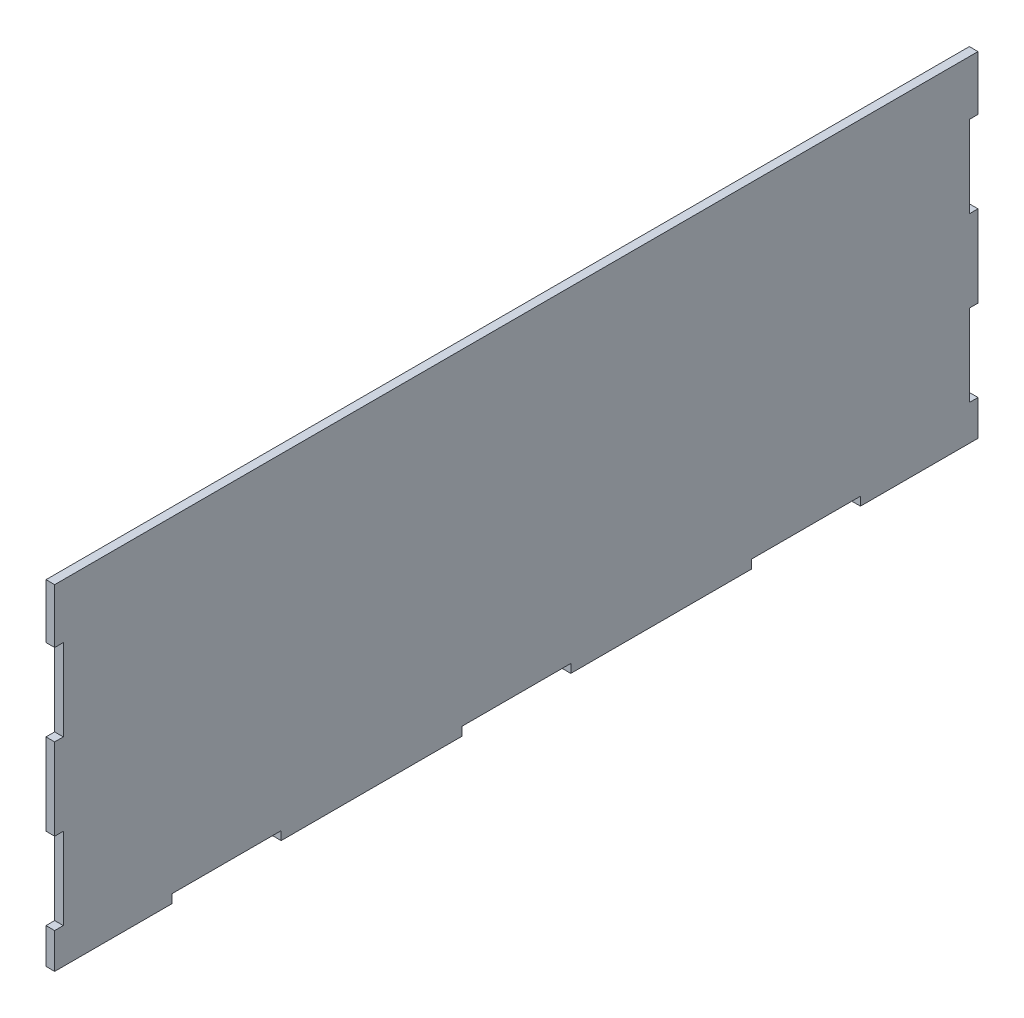
ISO-10303-21;
HEADER;
FILE_DESCRIPTION(('STEP AP214'),'2;1');
FILE_NAME('part.step','',(''),(''),'','','');
FILE_SCHEMA(('AUTOMOTIVE_DESIGN { 1 0 10303 214 1 1 1 1 }'));
ENDSEC;
DATA;
#1=APPLICATION_CONTEXT('core data for automotive mechanical design processes');
#2=APPLICATION_PROTOCOL_DEFINITION('international standard','automotive_design',2000,#1);
#3=PRODUCT_CONTEXT('',#1,'mechanical');
#4=PRODUCT('Part','Part','',(#3));
#5=PRODUCT_RELATED_PRODUCT_CATEGORY('part','',(#4));
#6=PRODUCT_DEFINITION_FORMATION('','',#4);
#7=PRODUCT_DEFINITION_CONTEXT('part definition',#1,'design');
#8=PRODUCT_DEFINITION('design','',#6,#7);
#9=PRODUCT_DEFINITION_SHAPE('','',#8);
#10=(LENGTH_UNIT() NAMED_UNIT(*) SI_UNIT(.MILLI.,.METRE.));
#11=(NAMED_UNIT(*) PLANE_ANGLE_UNIT() SI_UNIT($,.RADIAN.));
#12=(NAMED_UNIT(*) SI_UNIT($,.STERADIAN.) SOLID_ANGLE_UNIT());
#13=UNCERTAINTY_MEASURE_WITH_UNIT(LENGTH_MEASURE(1.E-05),#10,'distance_accuracy_value','');
#14=(GEOMETRIC_REPRESENTATION_CONTEXT(3) GLOBAL_UNCERTAINTY_ASSIGNED_CONTEXT((#13)) GLOBAL_UNIT_ASSIGNED_CONTEXT((#10,
#11,#12)) REPRESENTATION_CONTEXT('',''));
#15=CARTESIAN_POINT('',(0.,0.,0.));
#16=DIRECTION('',(0.,0.,1.));
#17=DIRECTION('',(1.,0.,0.));
#18=AXIS2_PLACEMENT_3D('',#15,#16,#17);
#19=CARTESIAN_POINT('',(3.175,-123.,0.));
#20=DIRECTION('',(0.,1.,0.));
#21=DIRECTION('',(0.,0.,1.));
#22=AXIS2_PLACEMENT_3D('',#19,#20,#21);
#23=PLANE('',#22);
#24=DIRECTION('',(0.,0.,-1.));
#25=VECTOR('',#24,1.);
#26=CARTESIAN_POINT('',(0.,-123.,0.));
#27=LINE('',#26,#25);
#28=CARTESIAN_POINT('',(0.,-123.,-189.53));
#29=VERTEX_POINT('',#28);
#30=CARTESIAN_POINT('',(0.,-123.,-255.88));
#31=VERTEX_POINT('',#30);
#32=EDGE_CURVE('E258',#29,#31,#27,.T.);
#33=ORIENTED_EDGE('',*,*,#32,.T.);
#34=DIRECTION('',(1.,0.,0.));
#35=VECTOR('',#34,1.);
#36=CARTESIAN_POINT('',(0.,-123.,-255.88));
#37=LINE('',#36,#35);
#38=CARTESIAN_POINT('',(3.175,-123.,-255.88));
#39=VERTEX_POINT('',#38);
#40=EDGE_CURVE('E242',#31,#39,#37,.T.);
#41=ORIENTED_EDGE('',*,*,#40,.T.);
#42=DIRECTION('',(0.,0.,-1.));
#43=VECTOR('',#42,1.);
#44=CARTESIAN_POINT('',(3.175,-123.,0.));
#45=LINE('',#44,#43);
#46=CARTESIAN_POINT('',(3.175,-123.,-189.53));
#47=VERTEX_POINT('',#46);
#48=EDGE_CURVE('E621',#47,#39,#45,.T.);
#49=ORIENTED_EDGE('',*,*,#48,.F.);
#50=DIRECTION('',(1.,0.,0.));
#51=VECTOR('',#50,1.);
#52=CARTESIAN_POINT('',(0.,-123.,-189.53));
#53=LINE('',#52,#51);
#54=EDGE_CURVE('E264',#29,#47,#53,.T.);
#55=ORIENTED_EDGE('',*,*,#54,.F.);
#56=EDGE_LOOP('',(#33,#41,#49,#55));
#57=FACE_BOUND('',#56,.T.);
#58=ADVANCED_FACE('F33',(#57),#23,.F.);
#59=CARTESIAN_POINT('',(0.,-123.,-83.18));
#60=VERTEX_POINT('',#59);
#61=CARTESIAN_POINT('',(0.,-123.,-149.53));
#62=VERTEX_POINT('',#61);
#63=EDGE_CURVE('E265',#60,#62,#27,.T.);
#64=ORIENTED_EDGE('',*,*,#63,.T.);
#65=DIRECTION('',(1.,0.,0.));
#66=VECTOR('',#65,1.);
#67=CARTESIAN_POINT('',(0.,-123.,-149.53));
#68=LINE('',#67,#66);
#69=CARTESIAN_POINT('',(3.175,-123.,-149.53));
#70=VERTEX_POINT('',#69);
#71=EDGE_CURVE('E476',#62,#70,#68,.T.);
#72=ORIENTED_EDGE('',*,*,#71,.T.);
#73=CARTESIAN_POINT('',(3.175,-123.,-83.18));
#74=VERTEX_POINT('',#73);
#75=EDGE_CURVE('E413',#74,#70,#45,.T.);
#76=ORIENTED_EDGE('',*,*,#75,.F.);
#77=DIRECTION('',(1.,0.,0.));
#78=VECTOR('',#77,1.);
#79=CARTESIAN_POINT('',(0.,-123.,-83.18));
#80=LINE('',#79,#78);
#81=EDGE_CURVE('E489',#60,#74,#80,.T.);
#82=ORIENTED_EDGE('',*,*,#81,.F.);
#83=EDGE_LOOP('',(#64,#72,#76,#82));
#84=FACE_BOUND('',#83,.T.);
#85=ADVANCED_FACE('F506',(#84),#23,.F.);
#86=CARTESIAN_POINT('',(0.,-123.,0.));
#87=VERTEX_POINT('',#86);
#88=CARTESIAN_POINT('',(0.,-123.,-43.18));
#89=VERTEX_POINT('',#88);
#90=EDGE_CURVE('E269',#87,#89,#27,.T.);
#91=ORIENTED_EDGE('',*,*,#90,.T.);
#92=DIRECTION('',(1.,0.,0.));
#93=VECTOR('',#92,1.);
#94=CARTESIAN_POINT('',(0.,-123.,-43.18));
#95=LINE('',#94,#93);
#96=CARTESIAN_POINT('',(3.175,-123.,-43.18));
#97=VERTEX_POINT('',#96);
#98=EDGE_CURVE('E458',#89,#97,#95,.T.);
#99=ORIENTED_EDGE('',*,*,#98,.T.);
#100=CARTESIAN_POINT('',(3.175,-123.,0.));
#101=VERTEX_POINT('',#100);
#102=EDGE_CURVE('E409',#101,#97,#45,.T.);
#103=ORIENTED_EDGE('',*,*,#102,.F.);
#104=DIRECTION('',(-1.,0.,0.));
#105=VECTOR('',#104,1.);
#106=CARTESIAN_POINT('',(3.175,-123.,0.));
#107=LINE('',#106,#105);
#108=EDGE_CURVE('E293',#101,#87,#107,.T.);
#109=ORIENTED_EDGE('',*,*,#108,.T.);
#110=EDGE_LOOP('',(#91,#99,#103,#109));
#111=FACE_BOUND('',#110,.T.);
#112=ADVANCED_FACE('F457',(#111),#23,.F.);
#113=CARTESIAN_POINT('',(3.175,0.,0.));
#114=DIRECTION('',(0.,0.,-1.));
#115=DIRECTION('',(0.,1.,0.));
#116=AXIS2_PLACEMENT_3D('',#113,#114,#115);
#117=PLANE('',#116);
#118=DIRECTION('',(0.,-1.,0.));
#119=VECTOR('',#118,1.);
#120=CARTESIAN_POINT('',(0.,0.,0.));
#121=LINE('',#120,#119);
#122=CARTESIAN_POINT('',(0.,-50.,0.));
#123=VERTEX_POINT('',#122);
#124=CARTESIAN_POINT('',(0.,-80.,0.));
#125=VERTEX_POINT('',#124);
#126=EDGE_CURVE('E460',#123,#125,#121,.T.);
#127=ORIENTED_EDGE('',*,*,#126,.T.);
#128=DIRECTION('',(1.,0.,0.));
#129=VECTOR('',#128,1.);
#130=CARTESIAN_POINT('',(-6.825,-80.,0.));
#131=LINE('',#130,#129);
#132=CARTESIAN_POINT('',(3.175,-80.,0.));
#133=VERTEX_POINT('',#132);
#134=EDGE_CURVE('E341',#125,#133,#131,.T.);
#135=ORIENTED_EDGE('',*,*,#134,.T.);
#136=DIRECTION('',(0.,-1.,0.));
#137=VECTOR('',#136,1.);
#138=CARTESIAN_POINT('',(3.175,0.,0.));
#139=LINE('',#138,#137);
#140=CARTESIAN_POINT('',(3.175,-50.,0.));
#141=VERTEX_POINT('',#140);
#142=EDGE_CURVE('E408',#141,#133,#139,.T.);
#143=ORIENTED_EDGE('',*,*,#142,.F.);
#144=DIRECTION('',(1.,0.,0.));
#145=VECTOR('',#144,1.);
#146=CARTESIAN_POINT('',(-6.825,-50.,0.));
#147=LINE('',#146,#145);
#148=EDGE_CURVE('E359',#123,#141,#147,.T.);
#149=ORIENTED_EDGE('',*,*,#148,.F.);
#150=EDGE_LOOP('',(#127,#135,#143,#149));
#151=FACE_BOUND('',#150,.T.);
#152=ADVANCED_FACE('F446',(#151),#117,.F.);
#153=CARTESIAN_POINT('',(0.,0.,0.));
#154=VERTEX_POINT('',#153);
#155=CARTESIAN_POINT('',(0.,-20.,0.));
#156=VERTEX_POINT('',#155);
#157=EDGE_CURVE('E270',#154,#156,#121,.T.);
#158=ORIENTED_EDGE('',*,*,#157,.T.);
#159=DIRECTION('',(1.,0.,0.));
#160=VECTOR('',#159,1.);
#161=CARTESIAN_POINT('',(-6.825,-20.,0.));
#162=LINE('',#161,#160);
#163=CARTESIAN_POINT('',(3.175,-20.,0.));
#164=VERTEX_POINT('',#163);
#165=EDGE_CURVE('E360',#156,#164,#162,.T.);
#166=ORIENTED_EDGE('',*,*,#165,.T.);
#167=CARTESIAN_POINT('',(3.175,0.,0.));
#168=VERTEX_POINT('',#167);
#169=EDGE_CURVE('E404',#168,#164,#139,.T.);
#170=ORIENTED_EDGE('',*,*,#169,.F.);
#171=DIRECTION('',(-1.,0.,0.));
#172=VECTOR('',#171,1.);
#173=CARTESIAN_POINT('',(3.175,0.,0.));
#174=LINE('',#173,#172);
#175=EDGE_CURVE('E283',#168,#154,#174,.T.);
#176=ORIENTED_EDGE('',*,*,#175,.T.);
#177=EDGE_LOOP('',(#158,#166,#170,#176));
#178=FACE_BOUND('',#177,.T.);
#179=ADVANCED_FACE('F432',(#178),#117,.F.);
#180=CARTESIAN_POINT('',(3.175,0.,-339.05));
#181=DIRECTION('',(0.,0.,1.));
#182=DIRECTION('',(0.,-1.,0.));
#183=AXIS2_PLACEMENT_3D('',#180,#181,#182);
#184=PLANE('',#183);
#185=DIRECTION('',(0.,1.,0.));
#186=VECTOR('',#185,1.);
#187=CARTESIAN_POINT('',(0.,0.,-339.05));
#188=LINE('',#187,#186);
#189=CARTESIAN_POINT('',(0.,-123.,-339.05));
#190=VERTEX_POINT('',#189);
#191=CARTESIAN_POINT('',(0.,-110.,-339.05));
#192=VERTEX_POINT('',#191);
#193=EDGE_CURVE('E276',#190,#192,#188,.T.);
#194=ORIENTED_EDGE('',*,*,#193,.T.);
#195=DIRECTION('',(1.,0.,0.));
#196=VECTOR('',#195,1.);
#197=CARTESIAN_POINT('',(-6.825,-110.,-339.05));
#198=LINE('',#197,#196);
#199=CARTESIAN_POINT('',(3.175,-110.,-339.05));
#200=VERTEX_POINT('',#199);
#201=EDGE_CURVE('E377',#192,#200,#198,.T.);
#202=ORIENTED_EDGE('',*,*,#201,.T.);
#203=DIRECTION('',(0.,1.,0.));
#204=VECTOR('',#203,1.);
#205=CARTESIAN_POINT('',(3.175,0.,-339.05));
#206=LINE('',#205,#204);
#207=CARTESIAN_POINT('',(3.175,-123.,-339.05));
#208=VERTEX_POINT('',#207);
#209=EDGE_CURVE('E414',#208,#200,#206,.T.);
#210=ORIENTED_EDGE('',*,*,#209,.F.);
#211=DIRECTION('',(-1.,0.,0.));
#212=VECTOR('',#211,1.);
#213=CARTESIAN_POINT('',(3.175,-123.,-339.05));
#214=LINE('',#213,#212);
#215=EDGE_CURVE('E290',#208,#190,#214,.T.);
#216=ORIENTED_EDGE('',*,*,#215,.T.);
#217=EDGE_LOOP('',(#194,#202,#210,#216));
#218=FACE_BOUND('',#217,.T.);
#219=ADVANCED_FACE('F521',(#218),#184,.F.);
#220=CARTESIAN_POINT('',(3.175,-80.,-339.05));
#221=VERTEX_POINT('',#220);
#222=CARTESIAN_POINT('',(3.175,-50.,-339.05));
#223=VERTEX_POINT('',#222);
#224=EDGE_CURVE('E416',#221,#223,#206,.T.);
#225=ORIENTED_EDGE('',*,*,#224,.F.);
#226=DIRECTION('',(1.,0.,0.));
#227=VECTOR('',#226,1.);
#228=CARTESIAN_POINT('',(-6.825,-80.,-339.05));
#229=LINE('',#228,#227);
#230=CARTESIAN_POINT('',(0.,-80.,-339.05));
#231=VERTEX_POINT('',#230);
#232=EDGE_CURVE('E376',#231,#221,#229,.T.);
#233=ORIENTED_EDGE('',*,*,#232,.F.);
#234=CARTESIAN_POINT('',(0.,-50.,-339.05));
#235=VERTEX_POINT('',#234);
#236=EDGE_CURVE('E280',#231,#235,#188,.T.);
#237=ORIENTED_EDGE('',*,*,#236,.T.);
#238=DIRECTION('',(1.,0.,0.));
#239=VECTOR('',#238,1.);
#240=CARTESIAN_POINT('',(-6.825,-50.,-339.05));
#241=LINE('',#240,#239);
#242=EDGE_CURVE('E395',#235,#223,#241,.T.);
#243=ORIENTED_EDGE('',*,*,#242,.T.);
#244=EDGE_LOOP('',(#225,#233,#237,#243));
#245=FACE_BOUND('',#244,.T.);
#246=ADVANCED_FACE('F522',(#245),#184,.F.);
#247=CARTESIAN_POINT('',(3.175,-110.,0.));
#248=VERTEX_POINT('',#247);
#249=EDGE_CURVE('E282',#248,#101,#139,.T.);
#250=ORIENTED_EDGE('',*,*,#249,.F.);
#251=DIRECTION('',(1.,0.,0.));
#252=VECTOR('',#251,1.);
#253=CARTESIAN_POINT('',(-6.825,-110.,0.));
#254=LINE('',#253,#252);
#255=CARTESIAN_POINT('',(0.,-110.,0.));
#256=VERTEX_POINT('',#255);
#257=EDGE_CURVE('E346',#256,#248,#254,.T.);
#258=ORIENTED_EDGE('',*,*,#257,.F.);
#259=EDGE_CURVE('E398',#256,#87,#121,.T.);
#260=ORIENTED_EDGE('',*,*,#259,.T.);
#261=ORIENTED_EDGE('',*,*,#108,.F.);
#262=EDGE_LOOP('',(#250,#258,#260,#261));
#263=FACE_BOUND('',#262,.T.);
#264=ADVANCED_FACE('F35',(#263),#117,.F.);
#265=CARTESIAN_POINT('',(3.175,-123.,-295.88));
#266=VERTEX_POINT('',#265);
#267=EDGE_CURVE('E407',#266,#208,#45,.T.);
#268=ORIENTED_EDGE('',*,*,#267,.F.);
#269=DIRECTION('',(1.,0.,0.));
#270=VECTOR('',#269,1.);
#271=CARTESIAN_POINT('',(0.,-123.,-295.88));
#272=LINE('',#271,#270);
#273=CARTESIAN_POINT('',(0.,-123.,-295.88));
#274=VERTEX_POINT('',#273);
#275=EDGE_CURVE('E252',#274,#266,#272,.T.);
#276=ORIENTED_EDGE('',*,*,#275,.F.);
#277=EDGE_CURVE('E266',#274,#190,#27,.T.);
#278=ORIENTED_EDGE('',*,*,#277,.T.);
#279=ORIENTED_EDGE('',*,*,#215,.F.);
#280=EDGE_LOOP('',(#268,#276,#278,#279));
#281=FACE_BOUND('',#280,.T.);
#282=ADVANCED_FACE('F507',(#281),#23,.F.);
#283=CARTESIAN_POINT('',(3.175,-20.,-339.05));
#284=VERTEX_POINT('',#283);
#285=CARTESIAN_POINT('',(3.175,0.,-339.05));
#286=VERTEX_POINT('',#285);
#287=EDGE_CURVE('E412',#284,#286,#206,.T.);
#288=ORIENTED_EDGE('',*,*,#287,.F.);
#289=DIRECTION('',(1.,0.,0.));
#290=VECTOR('',#289,1.);
#291=CARTESIAN_POINT('',(-6.825,-20.,-339.05));
#292=LINE('',#291,#290);
#293=CARTESIAN_POINT('',(0.,-20.,-339.05));
#294=VERTEX_POINT('',#293);
#295=EDGE_CURVE('E394',#294,#284,#292,.T.);
#296=ORIENTED_EDGE('',*,*,#295,.F.);
#297=CARTESIAN_POINT('',(0.,0.,-339.05));
#298=VERTEX_POINT('',#297);
#299=EDGE_CURVE('E274',#294,#298,#188,.T.);
#300=ORIENTED_EDGE('',*,*,#299,.T.);
#301=DIRECTION('',(-1.,0.,0.));
#302=VECTOR('',#301,1.);
#303=CARTESIAN_POINT('',(3.175,0.,-339.05));
#304=LINE('',#303,#302);
#305=EDGE_CURVE('E286',#286,#298,#304,.T.);
#306=ORIENTED_EDGE('',*,*,#305,.F.);
#307=EDGE_LOOP('',(#288,#296,#300,#306));
#308=FACE_BOUND('',#307,.T.);
#309=ADVANCED_FACE('F514',(#308),#184,.F.);
#310=CARTESIAN_POINT('',(3.175,0.,0.));
#311=DIRECTION('',(0.,-1.,0.));
#312=DIRECTION('',(0.,0.,-1.));
#313=AXIS2_PLACEMENT_3D('',#310,#311,#312);
#314=PLANE('',#313);
#315=DIRECTION('',(0.,0.,1.));
#316=VECTOR('',#315,1.);
#317=CARTESIAN_POINT('',(0.,0.,0.));
#318=LINE('',#317,#316);
#319=EDGE_CURVE('E279',#298,#154,#318,.T.);
#320=ORIENTED_EDGE('',*,*,#319,.T.);
#321=ORIENTED_EDGE('',*,*,#175,.F.);
#322=DIRECTION('',(0.,0.,1.));
#323=VECTOR('',#322,1.);
#324=CARTESIAN_POINT('',(3.175,0.,0.));
#325=LINE('',#324,#323);
#326=EDGE_CURVE('E287',#286,#168,#325,.T.);
#327=ORIENTED_EDGE('',*,*,#326,.F.);
#328=ORIENTED_EDGE('',*,*,#305,.T.);
#329=EDGE_LOOP('',(#320,#321,#327,#328));
#330=FACE_BOUND('',#329,.T.);
#331=ADVANCED_FACE('F427',(#330),#314,.F.);
#332=CARTESIAN_POINT('',(3.175,0.,0.));
#333=DIRECTION('',(1.,0.,0.));
#334=DIRECTION('',(0.,0.,-1.));
#335=AXIS2_PLACEMENT_3D('',#332,#333,#334);
#336=PLANE('',#335);
#337=DIRECTION('',(0.,-1.,0.));
#338=VECTOR('',#337,1.);
#339=CARTESIAN_POINT('',(3.175,-123.,-255.88));
#340=LINE('',#339,#338);
#341=CARTESIAN_POINT('',(3.175,-119.825,-255.88));
#342=VERTEX_POINT('',#341);
#343=EDGE_CURVE('E247',#342,#39,#340,.T.);
#344=ORIENTED_EDGE('',*,*,#343,.F.);
#345=DIRECTION('',(0.,0.,1.));
#346=VECTOR('',#345,1.);
#347=CARTESIAN_POINT('',(3.175,-119.825,-255.88));
#348=LINE('',#347,#346);
#349=CARTESIAN_POINT('',(3.175,-119.825,-295.88));
#350=VERTEX_POINT('',#349);
#351=EDGE_CURVE('E261',#350,#342,#348,.T.);
#352=ORIENTED_EDGE('',*,*,#351,.F.);
#353=DIRECTION('',(0.,1.,0.));
#354=VECTOR('',#353,1.);
#355=CARTESIAN_POINT('',(3.175,-123.,-295.88));
#356=LINE('',#355,#354);
#357=EDGE_CURVE('E618',#266,#350,#356,.T.);
#358=ORIENTED_EDGE('',*,*,#357,.F.);
#359=ORIENTED_EDGE('',*,*,#267,.T.);
#360=ORIENTED_EDGE('',*,*,#209,.T.);
#361=DIRECTION('',(0.,0.,-1.));
#362=VECTOR('',#361,1.);
#363=CARTESIAN_POINT('',(3.175,-110.,-339.05));
#364=LINE('',#363,#362);
#365=CARTESIAN_POINT('',(3.175,-110.,-335.875));
#366=VERTEX_POINT('',#365);
#367=EDGE_CURVE('E374',#366,#200,#364,.T.);
#368=ORIENTED_EDGE('',*,*,#367,.F.);
#369=DIRECTION('',(0.,-1.,0.));
#370=VECTOR('',#369,1.);
#371=CARTESIAN_POINT('',(3.175,-80.,-335.875));
#372=LINE('',#371,#370);
#373=CARTESIAN_POINT('',(3.175,-80.,-335.875));
#374=VERTEX_POINT('',#373);
#375=EDGE_CURVE('E371',#374,#366,#372,.T.);
#376=ORIENTED_EDGE('',*,*,#375,.F.);
#377=DIRECTION('',(0.,0.,1.));
#378=VECTOR('',#377,1.);
#379=CARTESIAN_POINT('',(3.175,-80.,-339.05));
#380=LINE('',#379,#378);
#381=EDGE_CURVE('E363',#221,#374,#380,.T.);
#382=ORIENTED_EDGE('',*,*,#381,.F.);
#383=ORIENTED_EDGE('',*,*,#224,.T.);
#384=DIRECTION('',(0.,0.,-1.));
#385=VECTOR('',#384,1.);
#386=CARTESIAN_POINT('',(3.175,-50.,-339.05));
#387=LINE('',#386,#385);
#388=CARTESIAN_POINT('',(3.175,-50.,-335.875));
#389=VERTEX_POINT('',#388);
#390=EDGE_CURVE('E391',#389,#223,#387,.T.);
#391=ORIENTED_EDGE('',*,*,#390,.F.);
#392=DIRECTION('',(0.,-1.,0.));
#393=VECTOR('',#392,1.);
#394=CARTESIAN_POINT('',(3.175,-20.,-335.875));
#395=LINE('',#394,#393);
#396=CARTESIAN_POINT('',(3.175,-20.,-335.875));
#397=VERTEX_POINT('',#396);
#398=EDGE_CURVE('E388',#397,#389,#395,.T.);
#399=ORIENTED_EDGE('',*,*,#398,.F.);
#400=DIRECTION('',(0.,0.,1.));
#401=VECTOR('',#400,1.);
#402=CARTESIAN_POINT('',(3.175,-20.,-339.05));
#403=LINE('',#402,#401);
#404=EDGE_CURVE('E380',#284,#397,#403,.T.);
#405=ORIENTED_EDGE('',*,*,#404,.F.);
#406=ORIENTED_EDGE('',*,*,#287,.T.);
#407=ORIENTED_EDGE('',*,*,#326,.T.);
#408=ORIENTED_EDGE('',*,*,#169,.T.);
#409=DIRECTION('',(0.,0.,1.));
#410=VECTOR('',#409,1.);
#411=CARTESIAN_POINT('',(3.175,-20.,0.));
#412=LINE('',#411,#410);
#413=CARTESIAN_POINT('',(3.175,-20.,-3.175));
#414=VERTEX_POINT('',#413);
#415=EDGE_CURVE('E357',#414,#164,#412,.T.);
#416=ORIENTED_EDGE('',*,*,#415,.F.);
#417=DIRECTION('',(0.,1.,0.));
#418=VECTOR('',#417,1.);
#419=CARTESIAN_POINT('',(3.175,-20.,-3.175));
#420=LINE('',#419,#418);
#421=CARTESIAN_POINT('',(3.175,-50.,-3.175));
#422=VERTEX_POINT('',#421);
#423=EDGE_CURVE('E354',#422,#414,#420,.T.);
#424=ORIENTED_EDGE('',*,*,#423,.F.);
#425=DIRECTION('',(0.,0.,-1.));
#426=VECTOR('',#425,1.);
#427=CARTESIAN_POINT('',(3.175,-50.,0.));
#428=LINE('',#427,#426);
#429=EDGE_CURVE('E344',#141,#422,#428,.T.);
#430=ORIENTED_EDGE('',*,*,#429,.F.);
#431=ORIENTED_EDGE('',*,*,#142,.T.);
#432=DIRECTION('',(0.,0.,1.));
#433=VECTOR('',#432,1.);
#434=CARTESIAN_POINT('',(3.175,-80.,0.));
#435=LINE('',#434,#433);
#436=CARTESIAN_POINT('',(3.175,-80.,-3.175));
#437=VERTEX_POINT('',#436);
#438=EDGE_CURVE('E351',#437,#133,#435,.T.);
#439=ORIENTED_EDGE('',*,*,#438,.F.);
#440=DIRECTION('',(0.,1.,0.));
#441=VECTOR('',#440,1.);
#442=CARTESIAN_POINT('',(3.175,-80.,-3.175));
#443=LINE('',#442,#441);
#444=CARTESIAN_POINT('',(3.175,-110.,-3.175));
#445=VERTEX_POINT('',#444);
#446=EDGE_CURVE('E338',#445,#437,#443,.T.);
#447=ORIENTED_EDGE('',*,*,#446,.F.);
#448=DIRECTION('',(0.,0.,-1.));
#449=VECTOR('',#448,1.);
#450=CARTESIAN_POINT('',(3.175,-110.,0.));
#451=LINE('',#450,#449);
#452=EDGE_CURVE('E451',#248,#445,#451,.T.);
#453=ORIENTED_EDGE('',*,*,#452,.F.);
#454=ORIENTED_EDGE('',*,*,#249,.T.);
#455=ORIENTED_EDGE('',*,*,#102,.T.);
#456=DIRECTION('',(0.,-1.,0.));
#457=VECTOR('',#456,1.);
#458=CARTESIAN_POINT('',(3.175,-123.,-43.18));
#459=LINE('',#458,#457);
#460=CARTESIAN_POINT('',(3.175,-119.825,-43.18));
#461=VERTEX_POINT('',#460);
#462=EDGE_CURVE('E480',#461,#97,#459,.T.);
#463=ORIENTED_EDGE('',*,*,#462,.F.);
#464=DIRECTION('',(0.,0.,1.));
#465=VECTOR('',#464,1.);
#466=CARTESIAN_POINT('',(3.175,-119.825,-43.18));
#467=LINE('',#466,#465);
#468=CARTESIAN_POINT('',(3.175,-119.825,-83.18));
#469=VERTEX_POINT('',#468);
#470=EDGE_CURVE('E469',#469,#461,#467,.T.);
#471=ORIENTED_EDGE('',*,*,#470,.F.);
#472=DIRECTION('',(0.,1.,0.));
#473=VECTOR('',#472,1.);
#474=CARTESIAN_POINT('',(3.175,-123.,-83.18));
#475=LINE('',#474,#473);
#476=EDGE_CURVE('E473',#74,#469,#475,.T.);
#477=ORIENTED_EDGE('',*,*,#476,.F.);
#478=ORIENTED_EDGE('',*,*,#75,.T.);
#479=DIRECTION('',(0.,-1.,0.));
#480=VECTOR('',#479,1.);
#481=CARTESIAN_POINT('',(3.175,-123.,-149.53));
#482=LINE('',#481,#480);
#483=CARTESIAN_POINT('',(3.175,-119.825,-149.53));
#484=VERTEX_POINT('',#483);
#485=EDGE_CURVE('E628',#484,#70,#482,.T.);
#486=ORIENTED_EDGE('',*,*,#485,.F.);
#487=DIRECTION('',(0.,0.,1.));
#488=VECTOR('',#487,1.);
#489=CARTESIAN_POINT('',(3.175,-119.825,-149.53));
#490=LINE('',#489,#488);
#491=CARTESIAN_POINT('',(3.175,-119.825,-189.53));
#492=VERTEX_POINT('',#491);
#493=EDGE_CURVE('E635',#492,#484,#490,.T.);
#494=ORIENTED_EDGE('',*,*,#493,.F.);
#495=DIRECTION('',(0.,1.,0.));
#496=VECTOR('',#495,1.);
#497=CARTESIAN_POINT('',(3.175,-123.,-189.53));
#498=LINE('',#497,#496);
#499=EDGE_CURVE('E639',#47,#492,#498,.T.);
#500=ORIENTED_EDGE('',*,*,#499,.F.);
#501=ORIENTED_EDGE('',*,*,#48,.T.);
#502=EDGE_LOOP('',(#344,#352,#358,#359,#360,#368,#376,#382,#383,#391,#399,#405,#406,#407,#408,
#416,#424,#430,#431,#439,#447,#453,#454,#455,#463,#471,#477,#478,#486,#494,#500,#501));
#503=FACE_BOUND('',#502,.T.);
#504=ADVANCED_FACE('F420',(#503),#336,.T.);
#505=CARTESIAN_POINT('',(0.,0.,0.));
#506=DIRECTION('',(1.,0.,0.));
#507=DIRECTION('',(0.,0.,-1.));
#508=AXIS2_PLACEMENT_3D('',#505,#506,#507);
#509=PLANE('',#508);
#510=DIRECTION('',(0.,0.,1.));
#511=VECTOR('',#510,1.);
#512=CARTESIAN_POINT('',(0.,-119.825,-255.88));
#513=LINE('',#512,#511);
#514=CARTESIAN_POINT('',(0.,-119.825,-295.88));
#515=VERTEX_POINT('',#514);
#516=CARTESIAN_POINT('',(0.,-119.825,-255.88));
#517=VERTEX_POINT('',#516);
#518=EDGE_CURVE('E48',#515,#517,#513,.T.);
#519=ORIENTED_EDGE('',*,*,#518,.T.);
#520=DIRECTION('',(0.,-1.,0.));
#521=VECTOR('',#520,1.);
#522=CARTESIAN_POINT('',(0.,-123.,-255.88));
#523=LINE('',#522,#521);
#524=EDGE_CURVE('E245',#517,#31,#523,.T.);
#525=ORIENTED_EDGE('',*,*,#524,.T.);
#526=ORIENTED_EDGE('',*,*,#32,.F.);
#527=DIRECTION('',(0.,1.,0.));
#528=VECTOR('',#527,1.);
#529=CARTESIAN_POINT('',(0.,-123.,-189.53));
#530=LINE('',#529,#528);
#531=CARTESIAN_POINT('',(0.,-119.825,-189.53));
#532=VERTEX_POINT('',#531);
#533=EDGE_CURVE('E634',#29,#532,#530,.T.);
#534=ORIENTED_EDGE('',*,*,#533,.T.);
#535=DIRECTION('',(0.,0.,1.));
#536=VECTOR('',#535,1.);
#537=CARTESIAN_POINT('',(0.,-119.825,-149.53));
#538=LINE('',#537,#536);
#539=CARTESIAN_POINT('',(0.,-119.825,-149.53));
#540=VERTEX_POINT('',#539);
#541=EDGE_CURVE('E56',#532,#540,#538,.T.);
#542=ORIENTED_EDGE('',*,*,#541,.T.);
#543=DIRECTION('',(0.,-1.,0.));
#544=VECTOR('',#543,1.);
#545=CARTESIAN_POINT('',(0.,-123.,-149.53));
#546=LINE('',#545,#544);
#547=EDGE_CURVE('E631',#540,#62,#546,.T.);
#548=ORIENTED_EDGE('',*,*,#547,.T.);
#549=ORIENTED_EDGE('',*,*,#63,.F.);
#550=DIRECTION('',(0.,1.,0.));
#551=VECTOR('',#550,1.);
#552=CARTESIAN_POINT('',(0.,-123.,-83.18));
#553=LINE('',#552,#551);
#554=CARTESIAN_POINT('',(0.,-119.825,-83.18));
#555=VERTEX_POINT('',#554);
#556=EDGE_CURVE('E468',#60,#555,#553,.T.);
#557=ORIENTED_EDGE('',*,*,#556,.T.);
#558=DIRECTION('',(0.,0.,1.));
#559=VECTOR('',#558,1.);
#560=CARTESIAN_POINT('',(0.,-119.825,-43.18));
#561=LINE('',#560,#559);
#562=CARTESIAN_POINT('',(0.,-119.825,-43.18));
#563=VERTEX_POINT('',#562);
#564=EDGE_CURVE('E466',#555,#563,#561,.T.);
#565=ORIENTED_EDGE('',*,*,#564,.T.);
#566=DIRECTION('',(0.,-1.,0.));
#567=VECTOR('',#566,1.);
#568=CARTESIAN_POINT('',(0.,-123.,-43.18));
#569=LINE('',#568,#567);
#570=EDGE_CURVE('E464',#563,#89,#569,.T.);
#571=ORIENTED_EDGE('',*,*,#570,.T.);
#572=ORIENTED_EDGE('',*,*,#90,.F.);
#573=ORIENTED_EDGE('',*,*,#259,.F.);
#574=DIRECTION('',(0.,0.,-1.));
#575=VECTOR('',#574,1.);
#576=CARTESIAN_POINT('',(0.,-110.,0.));
#577=LINE('',#576,#575);
#578=CARTESIAN_POINT('',(0.,-110.,-3.175));
#579=VERTEX_POINT('',#578);
#580=EDGE_CURVE('E323',#256,#579,#577,.T.);
#581=ORIENTED_EDGE('',*,*,#580,.T.);
#582=DIRECTION('',(0.,1.,0.));
#583=VECTOR('',#582,1.);
#584=CARTESIAN_POINT('',(0.,0.,-3.17499999999999));
#585=LINE('',#584,#583);
#586=CARTESIAN_POINT('',(0.,-80.,-3.175));
#587=VERTEX_POINT('',#586);
#588=EDGE_CURVE('E41',#579,#587,#585,.T.);
#589=ORIENTED_EDGE('',*,*,#588,.T.);
#590=DIRECTION('',(0.,0.,1.));
#591=VECTOR('',#590,1.);
#592=CARTESIAN_POINT('',(0.,-80.,0.));
#593=LINE('',#592,#591);
#594=EDGE_CURVE('E11',#587,#125,#593,.T.);
#595=ORIENTED_EDGE('',*,*,#594,.T.);
#596=ORIENTED_EDGE('',*,*,#126,.F.);
#597=DIRECTION('',(0.,0.,-1.));
#598=VECTOR('',#597,1.);
#599=CARTESIAN_POINT('',(0.,-50.,0.));
#600=LINE('',#599,#598);
#601=CARTESIAN_POINT('',(0.,-50.,-3.175));
#602=VERTEX_POINT('',#601);
#603=EDGE_CURVE('E314',#123,#602,#600,.T.);
#604=ORIENTED_EDGE('',*,*,#603,.T.);
#605=DIRECTION('',(0.,1.,0.));
#606=VECTOR('',#605,1.);
#607=CARTESIAN_POINT('',(0.,0.,-3.175));
#608=LINE('',#607,#606);
#609=CARTESIAN_POINT('',(0.,-20.,-3.175));
#610=VERTEX_POINT('',#609);
#611=EDGE_CURVE('E317',#602,#610,#608,.T.);
#612=ORIENTED_EDGE('',*,*,#611,.T.);
#613=DIRECTION('',(0.,0.,1.));
#614=VECTOR('',#613,1.);
#615=CARTESIAN_POINT('',(0.,-20.,0.));
#616=LINE('',#615,#614);
#617=EDGE_CURVE('E320',#610,#156,#616,.T.);
#618=ORIENTED_EDGE('',*,*,#617,.T.);
#619=ORIENTED_EDGE('',*,*,#157,.F.);
#620=ORIENTED_EDGE('',*,*,#319,.F.);
#621=ORIENTED_EDGE('',*,*,#299,.F.);
#622=DIRECTION('',(0.,0.,1.));
#623=VECTOR('',#622,1.);
#624=CARTESIAN_POINT('',(0.,-19.9999999999996,0.));
#625=LINE('',#624,#623);
#626=CARTESIAN_POINT('',(0.,-20.,-335.875));
#627=VERTEX_POINT('',#626);
#628=EDGE_CURVE('E296',#294,#627,#625,.T.);
#629=ORIENTED_EDGE('',*,*,#628,.T.);
#630=DIRECTION('',(0.,-1.,0.));
#631=VECTOR('',#630,1.);
#632=CARTESIAN_POINT('',(0.,0.,-335.875));
#633=LINE('',#632,#631);
#634=CARTESIAN_POINT('',(0.,-50.,-335.875));
#635=VERTEX_POINT('',#634);
#636=EDGE_CURVE('E299',#627,#635,#633,.T.);
#637=ORIENTED_EDGE('',*,*,#636,.T.);
#638=DIRECTION('',(0.,0.,-1.));
#639=VECTOR('',#638,1.);
#640=CARTESIAN_POINT('',(0.,-50.,0.));
#641=LINE('',#640,#639);
#642=EDGE_CURVE('E302',#635,#235,#641,.T.);
#643=ORIENTED_EDGE('',*,*,#642,.T.);
#644=ORIENTED_EDGE('',*,*,#236,.F.);
#645=DIRECTION('',(0.,0.,1.));
#646=VECTOR('',#645,1.);
#647=CARTESIAN_POINT('',(0.,-80.,0.));
#648=LINE('',#647,#646);
#649=CARTESIAN_POINT('',(0.,-80.,-335.875));
#650=VERTEX_POINT('',#649);
#651=EDGE_CURVE('E305',#231,#650,#648,.T.);
#652=ORIENTED_EDGE('',*,*,#651,.T.);
#653=DIRECTION('',(0.,-1.,0.));
#654=VECTOR('',#653,1.);
#655=CARTESIAN_POINT('',(0.,0.,-335.875));
#656=LINE('',#655,#654);
#657=CARTESIAN_POINT('',(0.,-110.,-335.875));
#658=VERTEX_POINT('',#657);
#659=EDGE_CURVE('E308',#650,#658,#656,.T.);
#660=ORIENTED_EDGE('',*,*,#659,.T.);
#661=DIRECTION('',(0.,0.,-1.));
#662=VECTOR('',#661,1.);
#663=CARTESIAN_POINT('',(0.,-110.,0.));
#664=LINE('',#663,#662);
#665=EDGE_CURVE('E311',#658,#192,#664,.T.);
#666=ORIENTED_EDGE('',*,*,#665,.T.);
#667=ORIENTED_EDGE('',*,*,#193,.F.);
#668=ORIENTED_EDGE('',*,*,#277,.F.);
#669=DIRECTION('',(0.,1.,0.));
#670=VECTOR('',#669,1.);
#671=CARTESIAN_POINT('',(0.,-123.,-295.88));
#672=LINE('',#671,#670);
#673=EDGE_CURVE('E260',#274,#515,#672,.T.);
#674=ORIENTED_EDGE('',*,*,#673,.T.);
#675=EDGE_LOOP('',(#519,#525,#526,#534,#542,#548,#549,#557,#565,#571,#572,#573,#581,#589,#595,
#596,#604,#612,#618,#619,#620,#621,#629,#637,#643,#644,#652,#660,#666,#667,#668,#674));
#676=FACE_BOUND('',#675,.T.);
#677=ADVANCED_FACE('F256',(#676),#509,.F.);
#678=CARTESIAN_POINT('',(-6.825,-50.,-339.05));
#679=DIRECTION('',(0.,-1.,0.));
#680=DIRECTION('',(0.,0.,-1.));
#681=AXIS2_PLACEMENT_3D('',#678,#679,#680);
#682=PLANE('',#681);
#683=DIRECTION('',(1.,0.,0.));
#684=VECTOR('',#683,1.);
#685=CARTESIAN_POINT('',(-6.825,-50.,-335.875));
#686=LINE('',#685,#684);
#687=EDGE_CURVE('E399',#635,#389,#686,.T.);
#688=ORIENTED_EDGE('',*,*,#687,.T.);
#689=ORIENTED_EDGE('',*,*,#390,.T.);
#690=ORIENTED_EDGE('',*,*,#242,.F.);
#691=ORIENTED_EDGE('',*,*,#642,.F.);
#692=EDGE_LOOP('',(#688,#689,#690,#691));
#693=FACE_BOUND('',#692,.T.);
#694=ADVANCED_FACE('F544',(#693),#682,.F.);
#695=CARTESIAN_POINT('',(-6.825,-20.,-335.875));
#696=DIRECTION('',(0.,0.,1.));
#697=DIRECTION('',(1.,0.,0.));
#698=AXIS2_PLACEMENT_3D('',#695,#696,#697);
#699=PLANE('',#698);
#700=DIRECTION('',(1.,0.,0.));
#701=VECTOR('',#700,1.);
#702=CARTESIAN_POINT('',(-6.825,-20.,-335.875));
#703=LINE('',#702,#701);
#704=EDGE_CURVE('E401',#627,#397,#703,.T.);
#705=ORIENTED_EDGE('',*,*,#704,.T.);
#706=ORIENTED_EDGE('',*,*,#398,.T.);
#707=ORIENTED_EDGE('',*,*,#687,.F.);
#708=ORIENTED_EDGE('',*,*,#636,.F.);
#709=EDGE_LOOP('',(#705,#706,#707,#708));
#710=FACE_BOUND('',#709,.T.);
#711=ADVANCED_FACE('F551',(#710),#699,.F.);
#712=CARTESIAN_POINT('',(-6.825,-20.,-339.05));
#713=DIRECTION('',(0.,1.,0.));
#714=DIRECTION('',(0.,0.,1.));
#715=AXIS2_PLACEMENT_3D('',#712,#713,#714);
#716=PLANE('',#715);
#717=ORIENTED_EDGE('',*,*,#295,.T.);
#718=ORIENTED_EDGE('',*,*,#404,.T.);
#719=ORIENTED_EDGE('',*,*,#704,.F.);
#720=ORIENTED_EDGE('',*,*,#628,.F.);
#721=EDGE_LOOP('',(#717,#718,#719,#720));
#722=FACE_BOUND('',#721,.T.);
#723=ADVANCED_FACE('F547',(#722),#716,.F.);
#724=CARTESIAN_POINT('',(-6.825,-110.,-339.05));
#725=DIRECTION('',(0.,-1.,0.));
#726=DIRECTION('',(0.,0.,-1.));
#727=AXIS2_PLACEMENT_3D('',#724,#725,#726);
#728=PLANE('',#727);
#729=DIRECTION('',(1.,0.,0.));
#730=VECTOR('',#729,1.);
#731=CARTESIAN_POINT('',(-6.825,-110.,-335.875));
#732=LINE('',#731,#730);
#733=EDGE_CURVE('E381',#658,#366,#732,.T.);
#734=ORIENTED_EDGE('',*,*,#733,.T.);
#735=ORIENTED_EDGE('',*,*,#367,.T.);
#736=ORIENTED_EDGE('',*,*,#201,.F.);
#737=ORIENTED_EDGE('',*,*,#665,.F.);
#738=EDGE_LOOP('',(#734,#735,#736,#737));
#739=FACE_BOUND('',#738,.T.);
#740=ADVANCED_FACE('F550',(#739),#728,.F.);
#741=CARTESIAN_POINT('',(-6.825,-80.,-335.875));
#742=DIRECTION('',(0.,0.,1.));
#743=DIRECTION('',(1.,0.,0.));
#744=AXIS2_PLACEMENT_3D('',#741,#742,#743);
#745=PLANE('',#744);
#746=DIRECTION('',(1.,0.,0.));
#747=VECTOR('',#746,1.);
#748=CARTESIAN_POINT('',(-6.825,-80.,-335.875));
#749=LINE('',#748,#747);
#750=EDGE_CURVE('E383',#650,#374,#749,.T.);
#751=ORIENTED_EDGE('',*,*,#750,.T.);
#752=ORIENTED_EDGE('',*,*,#375,.T.);
#753=ORIENTED_EDGE('',*,*,#733,.F.);
#754=ORIENTED_EDGE('',*,*,#659,.F.);
#755=EDGE_LOOP('',(#751,#752,#753,#754));
#756=FACE_BOUND('',#755,.T.);
#757=ADVANCED_FACE('F562',(#756),#745,.F.);
#758=CARTESIAN_POINT('',(-6.825,-80.,-339.05));
#759=DIRECTION('',(0.,1.,0.));
#760=DIRECTION('',(0.,0.,1.));
#761=AXIS2_PLACEMENT_3D('',#758,#759,#760);
#762=PLANE('',#761);
#763=ORIENTED_EDGE('',*,*,#232,.T.);
#764=ORIENTED_EDGE('',*,*,#381,.T.);
#765=ORIENTED_EDGE('',*,*,#750,.F.);
#766=ORIENTED_EDGE('',*,*,#651,.F.);
#767=EDGE_LOOP('',(#763,#764,#765,#766));
#768=FACE_BOUND('',#767,.T.);
#769=ADVANCED_FACE('F559',(#768),#762,.F.);
#770=CARTESIAN_POINT('',(-6.825,-20.,0.));
#771=DIRECTION('',(0.,1.,0.));
#772=DIRECTION('',(0.,0.,1.));
#773=AXIS2_PLACEMENT_3D('',#770,#771,#772);
#774=PLANE('',#773);
#775=DIRECTION('',(1.,0.,0.));
#776=VECTOR('',#775,1.);
#777=CARTESIAN_POINT('',(-6.825,-20.,-3.175));
#778=LINE('',#777,#776);
#779=EDGE_CURVE('E364',#610,#414,#778,.T.);
#780=ORIENTED_EDGE('',*,*,#779,.T.);
#781=ORIENTED_EDGE('',*,*,#415,.T.);
#782=ORIENTED_EDGE('',*,*,#165,.F.);
#783=ORIENTED_EDGE('',*,*,#617,.F.);
#784=EDGE_LOOP('',(#780,#781,#782,#783));
#785=FACE_BOUND('',#784,.T.);
#786=ADVANCED_FACE('F434',(#785),#774,.F.);
#787=CARTESIAN_POINT('',(-6.825,-20.,-3.175));
#788=DIRECTION('',(0.,0.,-1.));
#789=DIRECTION('',(0.,1.,0.));
#790=AXIS2_PLACEMENT_3D('',#787,#788,#789);
#791=PLANE('',#790);
#792=DIRECTION('',(1.,0.,0.));
#793=VECTOR('',#792,1.);
#794=CARTESIAN_POINT('',(-6.825,-50.,-3.175));
#795=LINE('',#794,#793);
#796=EDGE_CURVE('E366',#602,#422,#795,.T.);
#797=ORIENTED_EDGE('',*,*,#796,.T.);
#798=ORIENTED_EDGE('',*,*,#423,.T.);
#799=ORIENTED_EDGE('',*,*,#779,.F.);
#800=ORIENTED_EDGE('',*,*,#611,.F.);
#801=EDGE_LOOP('',(#797,#798,#799,#800));
#802=FACE_BOUND('',#801,.T.);
#803=ADVANCED_FACE('F438',(#802),#791,.F.);
#804=CARTESIAN_POINT('',(-6.825,-50.,0.));
#805=DIRECTION('',(0.,-1.,0.));
#806=DIRECTION('',(0.,0.,-1.));
#807=AXIS2_PLACEMENT_3D('',#804,#805,#806);
#808=PLANE('',#807);
#809=ORIENTED_EDGE('',*,*,#148,.T.);
#810=ORIENTED_EDGE('',*,*,#429,.T.);
#811=ORIENTED_EDGE('',*,*,#796,.F.);
#812=ORIENTED_EDGE('',*,*,#603,.F.);
#813=EDGE_LOOP('',(#809,#810,#811,#812));
#814=FACE_BOUND('',#813,.T.);
#815=ADVANCED_FACE('F495',(#814),#808,.F.);
#816=CARTESIAN_POINT('',(-6.825,-80.,0.));
#817=DIRECTION('',(0.,1.,0.));
#818=DIRECTION('',(0.,0.,1.));
#819=AXIS2_PLACEMENT_3D('',#816,#817,#818);
#820=PLANE('',#819);
#821=DIRECTION('',(1.,0.,0.));
#822=VECTOR('',#821,1.);
#823=CARTESIAN_POINT('',(-6.825,-80.,-3.175));
#824=LINE('',#823,#822);
#825=EDGE_CURVE('E336',#587,#437,#824,.T.);
#826=ORIENTED_EDGE('',*,*,#825,.T.);
#827=ORIENTED_EDGE('',*,*,#438,.T.);
#828=ORIENTED_EDGE('',*,*,#134,.F.);
#829=ORIENTED_EDGE('',*,*,#594,.F.);
#830=EDGE_LOOP('',(#826,#827,#828,#829));
#831=FACE_BOUND('',#830,.T.);
#832=ADVANCED_FACE('F493',(#831),#820,.F.);
#833=CARTESIAN_POINT('',(-6.825,-80.,-3.175));
#834=DIRECTION('',(0.,0.,-1.));
#835=DIRECTION('',(0.,1.,0.));
#836=AXIS2_PLACEMENT_3D('',#833,#834,#835);
#837=PLANE('',#836);
#838=DIRECTION('',(1.,0.,0.));
#839=VECTOR('',#838,1.);
#840=CARTESIAN_POINT('',(-6.825,-110.,-3.175));
#841=LINE('',#840,#839);
#842=EDGE_CURVE('E334',#579,#445,#841,.T.);
#843=ORIENTED_EDGE('',*,*,#842,.T.);
#844=ORIENTED_EDGE('',*,*,#446,.T.);
#845=ORIENTED_EDGE('',*,*,#825,.F.);
#846=ORIENTED_EDGE('',*,*,#588,.F.);
#847=EDGE_LOOP('',(#843,#844,#845,#846));
#848=FACE_BOUND('',#847,.T.);
#849=ADVANCED_FACE('F332',(#848),#837,.F.);
#850=CARTESIAN_POINT('',(-6.825,-110.,0.));
#851=DIRECTION('',(0.,-1.,0.));
#852=DIRECTION('',(0.,0.,-1.));
#853=AXIS2_PLACEMENT_3D('',#850,#851,#852);
#854=PLANE('',#853);
#855=ORIENTED_EDGE('',*,*,#257,.T.);
#856=ORIENTED_EDGE('',*,*,#452,.T.);
#857=ORIENTED_EDGE('',*,*,#842,.F.);
#858=ORIENTED_EDGE('',*,*,#580,.F.);
#859=EDGE_LOOP('',(#855,#856,#857,#858));
#860=FACE_BOUND('',#859,.T.);
#861=ADVANCED_FACE('F501',(#860),#854,.F.);
#862=CARTESIAN_POINT('',(0.,-123.,-43.18));
#863=DIRECTION('',(0.,0.,1.));
#864=DIRECTION('',(0.,-1.,0.));
#865=AXIS2_PLACEMENT_3D('',#862,#863,#864);
#866=PLANE('',#865);
#867=ORIENTED_EDGE('',*,*,#462,.T.);
#868=ORIENTED_EDGE('',*,*,#98,.F.);
#869=ORIENTED_EDGE('',*,*,#570,.F.);
#870=DIRECTION('',(1.,0.,0.));
#871=VECTOR('',#870,1.);
#872=CARTESIAN_POINT('',(0.,-119.825,-43.18));
#873=LINE('',#872,#871);
#874=EDGE_CURVE('E485',#563,#461,#873,.T.);
#875=ORIENTED_EDGE('',*,*,#874,.T.);
#876=EDGE_LOOP('',(#867,#868,#869,#875));
#877=FACE_BOUND('',#876,.T.);
#878=ADVANCED_FACE('F575',(#877),#866,.F.);
#879=CARTESIAN_POINT('',(0.,-119.825,-43.18));
#880=DIRECTION('',(0.,1.,0.));
#881=DIRECTION('',(0.,0.,1.));
#882=AXIS2_PLACEMENT_3D('',#879,#880,#881);
#883=PLANE('',#882);
#884=ORIENTED_EDGE('',*,*,#470,.T.);
#885=ORIENTED_EDGE('',*,*,#874,.F.);
#886=ORIENTED_EDGE('',*,*,#564,.F.);
#887=DIRECTION('',(1.,0.,0.));
#888=VECTOR('',#887,1.);
#889=CARTESIAN_POINT('',(0.,-119.825,-83.18));
#890=LINE('',#889,#888);
#891=EDGE_CURVE('E487',#555,#469,#890,.T.);
#892=ORIENTED_EDGE('',*,*,#891,.T.);
#893=EDGE_LOOP('',(#884,#885,#886,#892));
#894=FACE_BOUND('',#893,.T.);
#895=ADVANCED_FACE('F580',(#894),#883,.F.);
#896=CARTESIAN_POINT('',(0.,-123.,-83.18));
#897=DIRECTION('',(0.,0.,-1.));
#898=DIRECTION('',(-1.,0.,0.));
#899=AXIS2_PLACEMENT_3D('',#896,#897,#898);
#900=PLANE('',#899);
#901=ORIENTED_EDGE('',*,*,#476,.T.);
#902=ORIENTED_EDGE('',*,*,#891,.F.);
#903=ORIENTED_EDGE('',*,*,#556,.F.);
#904=ORIENTED_EDGE('',*,*,#81,.T.);
#905=EDGE_LOOP('',(#901,#902,#903,#904));
#906=FACE_BOUND('',#905,.T.);
#907=ADVANCED_FACE('F584',(#906),#900,.F.);
#908=CARTESIAN_POINT('',(0.,-123.,-149.53));
#909=DIRECTION('',(0.,0.,1.));
#910=DIRECTION('',(0.,-1.,0.));
#911=AXIS2_PLACEMENT_3D('',#908,#909,#910);
#912=PLANE('',#911);
#913=ORIENTED_EDGE('',*,*,#485,.T.);
#914=ORIENTED_EDGE('',*,*,#71,.F.);
#915=ORIENTED_EDGE('',*,*,#547,.F.);
#916=DIRECTION('',(1.,0.,0.));
#917=VECTOR('',#916,1.);
#918=CARTESIAN_POINT('',(0.,-119.825,-149.53));
#919=LINE('',#918,#917);
#920=EDGE_CURVE('E482',#540,#484,#919,.T.);
#921=ORIENTED_EDGE('',*,*,#920,.T.);
#922=EDGE_LOOP('',(#913,#914,#915,#921));
#923=FACE_BOUND('',#922,.T.);
#924=ADVANCED_FACE('F589',(#923),#912,.F.);
#925=CARTESIAN_POINT('',(0.,-119.825,-149.53));
#926=DIRECTION('',(0.,1.,0.));
#927=DIRECTION('',(0.,0.,1.));
#928=AXIS2_PLACEMENT_3D('',#925,#926,#927);
#929=PLANE('',#928);
#930=ORIENTED_EDGE('',*,*,#493,.T.);
#931=ORIENTED_EDGE('',*,*,#920,.F.);
#932=ORIENTED_EDGE('',*,*,#541,.F.);
#933=DIRECTION('',(1.,0.,0.));
#934=VECTOR('',#933,1.);
#935=CARTESIAN_POINT('',(0.,-119.825,-189.53));
#936=LINE('',#935,#934);
#937=EDGE_CURVE('E645',#532,#492,#936,.T.);
#938=ORIENTED_EDGE('',*,*,#937,.T.);
#939=EDGE_LOOP('',(#930,#931,#932,#938));
#940=FACE_BOUND('',#939,.T.);
#941=ADVANCED_FACE('F594',(#940),#929,.F.);
#942=CARTESIAN_POINT('',(0.,-123.,-189.53));
#943=DIRECTION('',(0.,0.,-1.));
#944=DIRECTION('',(-1.,0.,0.));
#945=AXIS2_PLACEMENT_3D('',#942,#943,#944);
#946=PLANE('',#945);
#947=ORIENTED_EDGE('',*,*,#499,.T.);
#948=ORIENTED_EDGE('',*,*,#937,.F.);
#949=ORIENTED_EDGE('',*,*,#533,.F.);
#950=ORIENTED_EDGE('',*,*,#54,.T.);
#951=EDGE_LOOP('',(#947,#948,#949,#950));
#952=FACE_BOUND('',#951,.T.);
#953=ADVANCED_FACE('F596',(#952),#946,.F.);
#954=CARTESIAN_POINT('',(0.,-123.,-255.88));
#955=DIRECTION('',(0.,0.,1.));
#956=DIRECTION('',(0.,-1.,0.));
#957=AXIS2_PLACEMENT_3D('',#954,#955,#956);
#958=PLANE('',#957);
#959=ORIENTED_EDGE('',*,*,#343,.T.);
#960=ORIENTED_EDGE('',*,*,#40,.F.);
#961=ORIENTED_EDGE('',*,*,#524,.F.);
#962=DIRECTION('',(1.,0.,0.));
#963=VECTOR('',#962,1.);
#964=CARTESIAN_POINT('',(0.,-119.825,-255.88));
#965=LINE('',#964,#963);
#966=EDGE_CURVE('E614',#517,#342,#965,.T.);
#967=ORIENTED_EDGE('',*,*,#966,.T.);
#968=EDGE_LOOP('',(#959,#960,#961,#967));
#969=FACE_BOUND('',#968,.T.);
#970=ADVANCED_FACE('F244',(#969),#958,.F.);
#971=CARTESIAN_POINT('',(0.,-119.825,-255.88));
#972=DIRECTION('',(0.,1.,0.));
#973=DIRECTION('',(0.,0.,1.));
#974=AXIS2_PLACEMENT_3D('',#971,#972,#973);
#975=PLANE('',#974);
#976=ORIENTED_EDGE('',*,*,#351,.T.);
#977=ORIENTED_EDGE('',*,*,#966,.F.);
#978=ORIENTED_EDGE('',*,*,#518,.F.);
#979=DIRECTION('',(1.,0.,0.));
#980=VECTOR('',#979,1.);
#981=CARTESIAN_POINT('',(0.,-119.825,-295.88));
#982=LINE('',#981,#980);
#983=EDGE_CURVE('E615',#515,#350,#982,.T.);
#984=ORIENTED_EDGE('',*,*,#983,.T.);
#985=EDGE_LOOP('',(#976,#977,#978,#984));
#986=FACE_BOUND('',#985,.T.);
#987=ADVANCED_FACE('F604',(#986),#975,.F.);
#988=CARTESIAN_POINT('',(0.,-123.,-295.88));
#989=DIRECTION('',(0.,0.,-1.));
#990=DIRECTION('',(-1.,0.,0.));
#991=AXIS2_PLACEMENT_3D('',#988,#989,#990);
#992=PLANE('',#991);
#993=ORIENTED_EDGE('',*,*,#357,.T.);
#994=ORIENTED_EDGE('',*,*,#983,.F.);
#995=ORIENTED_EDGE('',*,*,#673,.F.);
#996=ORIENTED_EDGE('',*,*,#275,.T.);
#997=EDGE_LOOP('',(#993,#994,#995,#996));
#998=FACE_BOUND('',#997,.T.);
#999=ADVANCED_FACE('F605',(#998),#992,.F.);
#1000=CLOSED_SHELL('',(#58,#85,#112,#152,#179,#219,#246,#264,#282,#309,#331,#504,#677,#694,#711,
#723,#740,#757,#769,#786,#803,#815,#832,#849,#861,#878,#895,#907,#924,#941,#953,#970,#987,#999));
#1001=MANIFOLD_SOLID_BREP('B2',#1000);
#1002=ADVANCED_BREP_SHAPE_REPRESENTATION('',(#18,#1001),#14);
#1003=SHAPE_DEFINITION_REPRESENTATION(#9,#1002);
ENDSEC;
END-ISO-10303-21;
